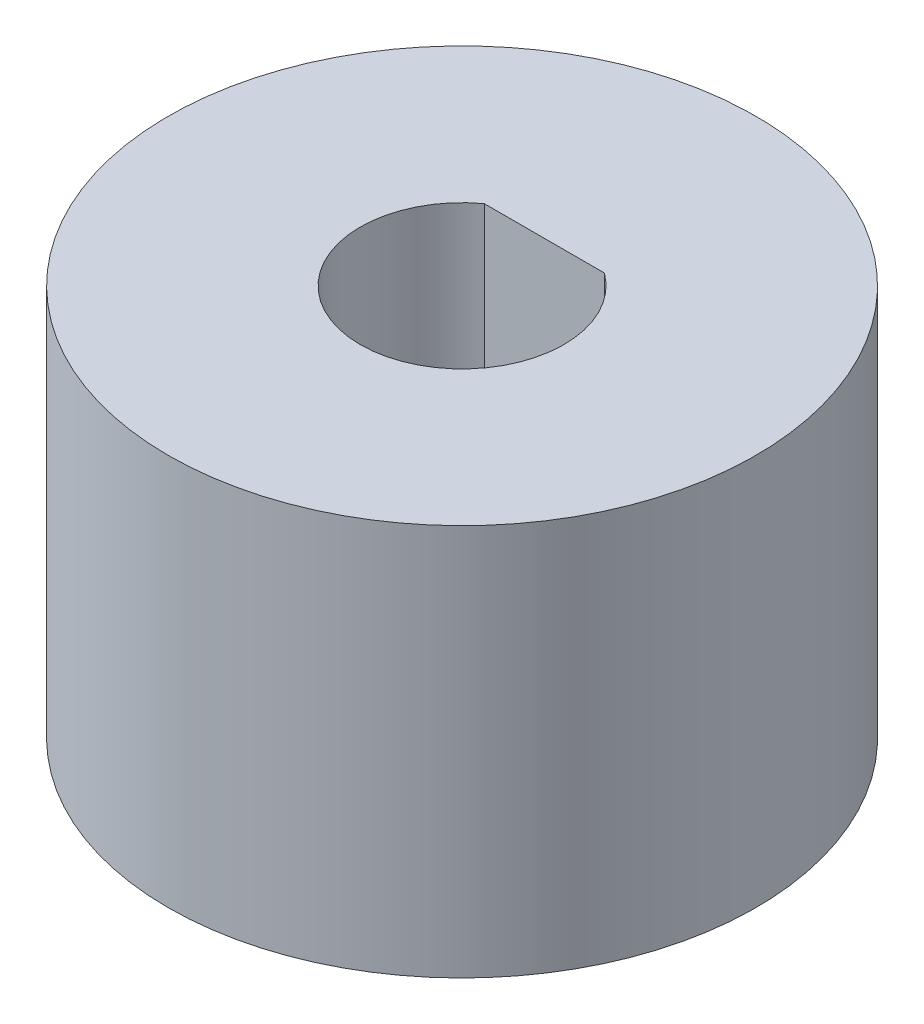
ISO-10303-21;
HEADER;
FILE_DESCRIPTION(('STEP AP214'),'2;1');
FILE_NAME('part.step','',(''),(''),'','','');
FILE_SCHEMA(('AUTOMOTIVE_DESIGN { 1 0 10303 214 1 1 1 1 }'));
ENDSEC;
DATA;
#1=APPLICATION_CONTEXT('core data for automotive mechanical design processes');
#2=APPLICATION_PROTOCOL_DEFINITION('international standard','automotive_design',2000,#1);
#3=PRODUCT_CONTEXT('',#1,'mechanical');
#4=PRODUCT('Part','Part','',(#3));
#5=PRODUCT_RELATED_PRODUCT_CATEGORY('part','',(#4));
#6=PRODUCT_DEFINITION_FORMATION('','',#4);
#7=PRODUCT_DEFINITION_CONTEXT('part definition',#1,'design');
#8=PRODUCT_DEFINITION('design','',#6,#7);
#9=PRODUCT_DEFINITION_SHAPE('','',#8);
#10=(LENGTH_UNIT() NAMED_UNIT(*) SI_UNIT(.MILLI.,.METRE.));
#11=(NAMED_UNIT(*) PLANE_ANGLE_UNIT() SI_UNIT($,.RADIAN.));
#12=(NAMED_UNIT(*) SI_UNIT($,.STERADIAN.) SOLID_ANGLE_UNIT());
#13=UNCERTAINTY_MEASURE_WITH_UNIT(LENGTH_MEASURE(1.E-05),#10,'distance_accuracy_value','');
#14=(GEOMETRIC_REPRESENTATION_CONTEXT(3) GLOBAL_UNCERTAINTY_ASSIGNED_CONTEXT((#13)) GLOBAL_UNIT_ASSIGNED_CONTEXT((#10,
#11,#12)) REPRESENTATION_CONTEXT('',''));
#15=CARTESIAN_POINT('',(0.,0.,0.));
#16=DIRECTION('',(0.,0.,1.));
#17=DIRECTION('',(1.,0.,0.));
#18=AXIS2_PLACEMENT_3D('',#15,#16,#17);
#19=CARTESIAN_POINT('',(0.,10.,0.));
#20=DIRECTION('',(0.,1.,0.));
#21=DIRECTION('',(0.,0.,1.));
#22=AXIS2_PLACEMENT_3D('',#19,#20,#21);
#23=PLANE('',#22);
#24=CARTESIAN_POINT('',(0.,10.,0.));
#25=DIRECTION('',(0.,1.,0.));
#26=DIRECTION('',(0.,0.,1.));
#27=AXIS2_PLACEMENT_3D('',#24,#25,#26);
#28=CIRCLE('',#27,7.5);
#29=CARTESIAN_POINT('',(0.,10.,7.5));
#30=VERTEX_POINT('',#29);
#31=EDGE_CURVE('E11',#30,#30,#28,.T.);
#32=ORIENTED_EDGE('',*,*,#31,.T.);
#33=EDGE_LOOP('',(#32));
#34=FACE_BOUND('',#33,.T.);
#35=DIRECTION('',(-1.,0.,0.));
#36=VECTOR('',#35,1.);
#37=CARTESIAN_POINT('',(-1.53297097167559,10.,-2.1));
#38=LINE('',#37,#36);
#39=CARTESIAN_POINT('',(1.53297097167559,10.,-2.1));
#40=VERTEX_POINT('',#39);
#41=CARTESIAN_POINT('',(-1.53297097167559,10.,-2.1));
#42=VERTEX_POINT('',#41);
#43=EDGE_CURVE('E74',#40,#42,#38,.T.);
#44=ORIENTED_EDGE('',*,*,#43,.F.);
#45=CARTESIAN_POINT('',(0.,10.,0.));
#46=DIRECTION('',(0.,1.,0.));
#47=DIRECTION('',(0.,0.,1.));
#48=AXIS2_PLACEMENT_3D('',#45,#46,#47);
#49=CIRCLE('',#48,2.6);
#50=EDGE_CURVE('E65',#42,#40,#49,.T.);
#51=ORIENTED_EDGE('',*,*,#50,.F.);
#52=EDGE_LOOP('',(#44,#51));
#53=FACE_BOUND('',#52,.T.);
#54=ADVANCED_FACE('F33',(#34,#53),#23,.T.);
#55=CARTESIAN_POINT('',(0.,0.,0.));
#56=DIRECTION('',(0.,1.,0.));
#57=DIRECTION('',(0.,0.,1.));
#58=AXIS2_PLACEMENT_3D('',#55,#56,#57);
#59=PLANE('',#58);
#60=CARTESIAN_POINT('',(0.,0.,0.));
#61=DIRECTION('',(0.,1.,0.));
#62=DIRECTION('',(0.,0.,1.));
#63=AXIS2_PLACEMENT_3D('',#60,#61,#62);
#64=CIRCLE('',#63,7.5);
#65=CARTESIAN_POINT('',(0.,0.,7.5));
#66=VERTEX_POINT('',#65);
#67=EDGE_CURVE('E37',#66,#66,#64,.T.);
#68=ORIENTED_EDGE('',*,*,#67,.F.);
#69=EDGE_LOOP('',(#68));
#70=FACE_BOUND('',#69,.T.);
#71=CARTESIAN_POINT('',(0.,0.,0.));
#72=DIRECTION('',(0.,1.,0.));
#73=DIRECTION('',(0.,0.,1.));
#74=AXIS2_PLACEMENT_3D('',#71,#72,#73);
#75=CIRCLE('',#74,2.6);
#76=CARTESIAN_POINT('',(-1.53297097167559,0.,-2.1));
#77=VERTEX_POINT('',#76);
#78=CARTESIAN_POINT('',(1.53297097167559,0.,-2.1));
#79=VERTEX_POINT('',#78);
#80=EDGE_CURVE('E55',#77,#79,#75,.T.);
#81=ORIENTED_EDGE('',*,*,#80,.T.);
#82=DIRECTION('',(-1.,0.,0.));
#83=VECTOR('',#82,1.);
#84=CARTESIAN_POINT('',(-1.53297097167559,0.,-2.1));
#85=LINE('',#84,#83);
#86=EDGE_CURVE('E61',#79,#77,#85,.T.);
#87=ORIENTED_EDGE('',*,*,#86,.T.);
#88=EDGE_LOOP('',(#81,#87));
#89=FACE_BOUND('',#88,.T.);
#90=ADVANCED_FACE('F71',(#70,#89),#59,.F.);
#91=CARTESIAN_POINT('',(0.,10.,0.));
#92=DIRECTION('',(0.,-1.,0.));
#93=DIRECTION('',(0.,0.,-1.));
#94=AXIS2_PLACEMENT_3D('',#91,#92,#93);
#95=CYLINDRICAL_SURFACE('',#94,7.5);
#96=ORIENTED_EDGE('',*,*,#31,.F.);
#97=EDGE_LOOP('',(#96));
#98=FACE_BOUND('',#97,.T.);
#99=ORIENTED_EDGE('',*,*,#67,.T.);
#100=EDGE_LOOP('',(#99));
#101=FACE_BOUND('',#100,.T.);
#102=ADVANCED_FACE('F35',(#98,#101),#95,.T.);
#103=CARTESIAN_POINT('',(0.,10.,0.));
#104=DIRECTION('',(0.,-1.,0.));
#105=DIRECTION('',(0.,0.,-1.));
#106=AXIS2_PLACEMENT_3D('',#103,#104,#105);
#107=CYLINDRICAL_SURFACE('',#106,2.6);
#108=ORIENTED_EDGE('',*,*,#80,.F.);
#109=DIRECTION('',(0.,-1.,0.));
#110=VECTOR('',#109,1.);
#111=CARTESIAN_POINT('',(-1.53297097167559,10.,-2.1));
#112=LINE('',#111,#110);
#113=EDGE_CURVE('E63',#42,#77,#112,.T.);
#114=ORIENTED_EDGE('',*,*,#113,.F.);
#115=ORIENTED_EDGE('',*,*,#50,.T.);
#116=DIRECTION('',(0.,-1.,0.));
#117=VECTOR('',#116,1.);
#118=CARTESIAN_POINT('',(1.53297097167559,10.,-2.1));
#119=LINE('',#118,#117);
#120=EDGE_CURVE('E48',#40,#79,#119,.T.);
#121=ORIENTED_EDGE('',*,*,#120,.T.);
#122=EDGE_LOOP('',(#108,#114,#115,#121));
#123=FACE_BOUND('',#122,.T.);
#124=ADVANCED_FACE('F67',(#123),#107,.F.);
#125=CARTESIAN_POINT('',(-1.53297097167559,10.,-2.1));
#126=DIRECTION('',(0.,0.,1.));
#127=DIRECTION('',(1.,0.,0.));
#128=AXIS2_PLACEMENT_3D('',#125,#126,#127);
#129=PLANE('',#128);
#130=ORIENTED_EDGE('',*,*,#86,.F.);
#131=ORIENTED_EDGE('',*,*,#120,.F.);
#132=ORIENTED_EDGE('',*,*,#43,.T.);
#133=ORIENTED_EDGE('',*,*,#113,.T.);
#134=EDGE_LOOP('',(#130,#131,#132,#133));
#135=FACE_BOUND('',#134,.T.);
#136=ADVANCED_FACE('F62',(#135),#129,.T.);
#137=CLOSED_SHELL('',(#54,#90,#102,#124,#136));
#138=MANIFOLD_SOLID_BREP('B2',#137);
#139=ADVANCED_BREP_SHAPE_REPRESENTATION('',(#18,#138),#14);
#140=SHAPE_DEFINITION_REPRESENTATION(#9,#139);
ENDSEC;
END-ISO-10303-21;
